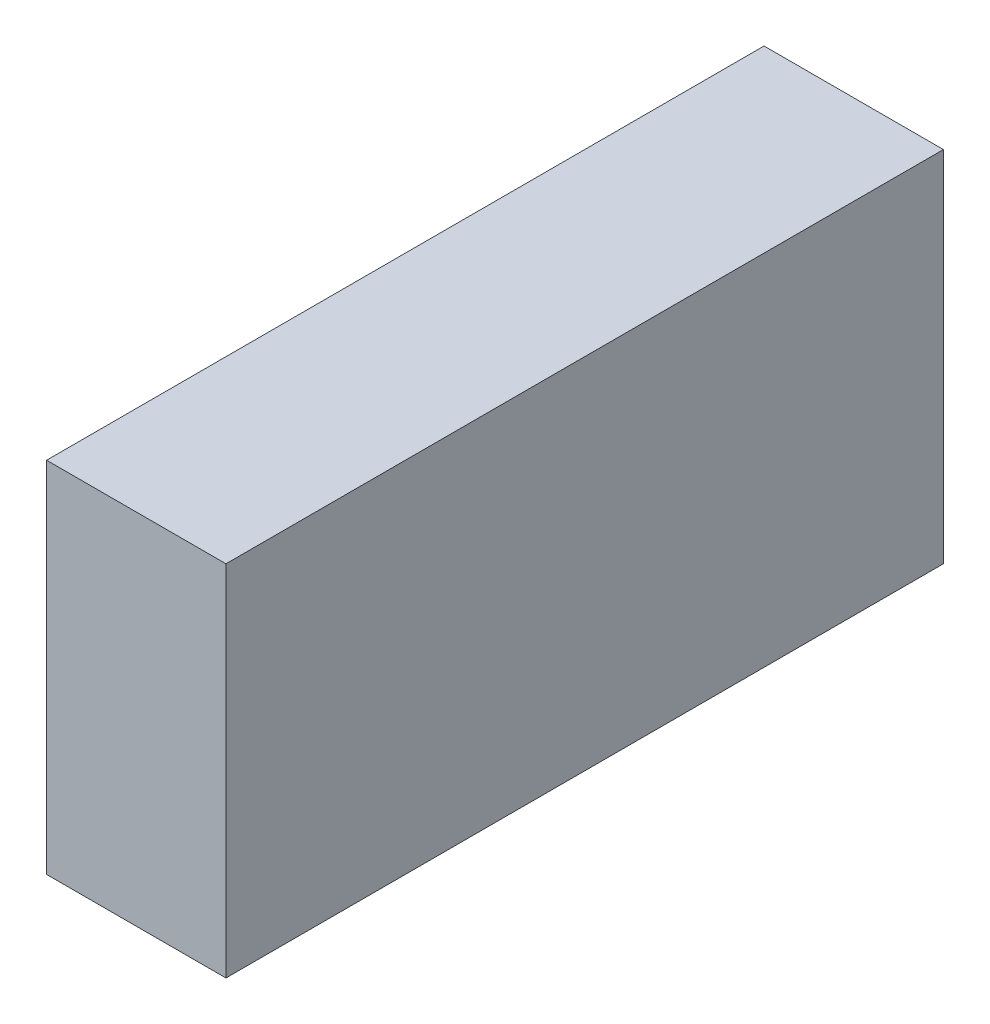
ISO-10303-21;
HEADER;
FILE_DESCRIPTION(('STEP AP214'),'2;1');
FILE_NAME('part.step','',(''),(''),'','','');
FILE_SCHEMA(('AUTOMOTIVE_DESIGN { 1 0 10303 214 1 1 1 1 }'));
ENDSEC;
DATA;
#1=APPLICATION_CONTEXT('core data for automotive mechanical design processes');
#2=APPLICATION_PROTOCOL_DEFINITION('international standard','automotive_design',2000,#1);
#3=PRODUCT_CONTEXT('',#1,'mechanical');
#4=PRODUCT('Part','Part','',(#3));
#5=PRODUCT_RELATED_PRODUCT_CATEGORY('part','',(#4));
#6=PRODUCT_DEFINITION_FORMATION('','',#4);
#7=PRODUCT_DEFINITION_CONTEXT('part definition',#1,'design');
#8=PRODUCT_DEFINITION('design','',#6,#7);
#9=PRODUCT_DEFINITION_SHAPE('','',#8);
#10=(LENGTH_UNIT() NAMED_UNIT(*) SI_UNIT(.MILLI.,.METRE.));
#11=(NAMED_UNIT(*) PLANE_ANGLE_UNIT() SI_UNIT($,.RADIAN.));
#12=(NAMED_UNIT(*) SI_UNIT($,.STERADIAN.) SOLID_ANGLE_UNIT());
#13=UNCERTAINTY_MEASURE_WITH_UNIT(LENGTH_MEASURE(1.E-05),#10,'distance_accuracy_value','');
#14=(GEOMETRIC_REPRESENTATION_CONTEXT(3) GLOBAL_UNCERTAINTY_ASSIGNED_CONTEXT((#13)) GLOBAL_UNIT_ASSIGNED_CONTEXT((#10,
#11,#12)) REPRESENTATION_CONTEXT('',''));
#15=CARTESIAN_POINT('',(0.,0.,0.));
#16=DIRECTION('',(0.,0.,1.));
#17=DIRECTION('',(1.,0.,0.));
#18=AXIS2_PLACEMENT_3D('',#15,#16,#17);
#19=CARTESIAN_POINT('',(10.,0.,0.));
#20=DIRECTION('',(0.,0.,-1.));
#21=DIRECTION('',(-1.,0.,0.));
#22=AXIS2_PLACEMENT_3D('',#19,#20,#21);
#23=PLANE('',#22);
#24=DIRECTION('',(0.,-1.,0.));
#25=VECTOR('',#24,1.);
#26=CARTESIAN_POINT('',(0.,0.,0.));
#27=LINE('',#26,#25);
#28=CARTESIAN_POINT('',(0.,20.,0.));
#29=VERTEX_POINT('',#28);
#30=CARTESIAN_POINT('',(0.,0.,0.));
#31=VERTEX_POINT('',#30);
#32=EDGE_CURVE('E105',#29,#31,#27,.T.);
#33=ORIENTED_EDGE('',*,*,#32,.T.);
#34=DIRECTION('',(-1.,0.,0.));
#35=VECTOR('',#34,1.);
#36=CARTESIAN_POINT('',(10.,0.,0.));
#37=LINE('',#36,#35);
#38=CARTESIAN_POINT('',(10.,0.,0.));
#39=VERTEX_POINT('',#38);
#40=EDGE_CURVE('E11',#39,#31,#37,.T.);
#41=ORIENTED_EDGE('',*,*,#40,.F.);
#42=DIRECTION('',(0.,-1.,0.));
#43=VECTOR('',#42,1.);
#44=CARTESIAN_POINT('',(10.,0.,0.));
#45=LINE('',#44,#43);
#46=CARTESIAN_POINT('',(10.,20.,0.));
#47=VERTEX_POINT('',#46);
#48=EDGE_CURVE('E89',#47,#39,#45,.T.);
#49=ORIENTED_EDGE('',*,*,#48,.F.);
#50=DIRECTION('',(-1.,0.,0.));
#51=VECTOR('',#50,1.);
#52=CARTESIAN_POINT('',(10.,20.,0.));
#53=LINE('',#52,#51);
#54=EDGE_CURVE('E97',#47,#29,#53,.T.);
#55=ORIENTED_EDGE('',*,*,#54,.T.);
#56=EDGE_LOOP('',(#33,#41,#49,#55));
#57=FACE_BOUND('',#56,.T.);
#58=ADVANCED_FACE('F39',(#57),#23,.F.);
#59=CARTESIAN_POINT('',(10.,0.,0.));
#60=DIRECTION('',(0.,1.,0.));
#61=DIRECTION('',(0.,0.,1.));
#62=AXIS2_PLACEMENT_3D('',#59,#60,#61);
#63=PLANE('',#62);
#64=DIRECTION('',(0.,0.,-1.));
#65=VECTOR('',#64,1.);
#66=CARTESIAN_POINT('',(0.,0.,0.));
#67=LINE('',#66,#65);
#68=CARTESIAN_POINT('',(0.,0.,-40.));
#69=VERTEX_POINT('',#68);
#70=EDGE_CURVE('E92',#31,#69,#67,.T.);
#71=ORIENTED_EDGE('',*,*,#70,.T.);
#72=DIRECTION('',(-1.,0.,0.));
#73=VECTOR('',#72,1.);
#74=CARTESIAN_POINT('',(10.,0.,-40.));
#75=LINE('',#74,#73);
#76=CARTESIAN_POINT('',(10.,0.,-40.));
#77=VERTEX_POINT('',#76);
#78=EDGE_CURVE('E50',#77,#69,#75,.T.);
#79=ORIENTED_EDGE('',*,*,#78,.F.);
#80=DIRECTION('',(0.,0.,-1.));
#81=VECTOR('',#80,1.);
#82=CARTESIAN_POINT('',(10.,0.,0.));
#83=LINE('',#82,#81);
#84=EDGE_CURVE('E82',#39,#77,#83,.T.);
#85=ORIENTED_EDGE('',*,*,#84,.F.);
#86=ORIENTED_EDGE('',*,*,#40,.T.);
#87=EDGE_LOOP('',(#71,#79,#85,#86));
#88=FACE_BOUND('',#87,.T.);
#89=ADVANCED_FACE('F93',(#88),#63,.F.);
#90=CARTESIAN_POINT('',(10.,0.,-40.));
#91=DIRECTION('',(0.,0.,1.));
#92=DIRECTION('',(1.,0.,0.));
#93=AXIS2_PLACEMENT_3D('',#90,#91,#92);
#94=PLANE('',#93);
#95=DIRECTION('',(0.,1.,0.));
#96=VECTOR('',#95,1.);
#97=CARTESIAN_POINT('',(0.,0.,-40.));
#98=LINE('',#97,#96);
#99=CARTESIAN_POINT('',(0.,20.,-40.));
#100=VERTEX_POINT('',#99);
#101=EDGE_CURVE('E72',#69,#100,#98,.T.);
#102=ORIENTED_EDGE('',*,*,#101,.T.);
#103=DIRECTION('',(-1.,0.,0.));
#104=VECTOR('',#103,1.);
#105=CARTESIAN_POINT('',(10.,20.,-40.));
#106=LINE('',#105,#104);
#107=CARTESIAN_POINT('',(10.,20.,-40.));
#108=VERTEX_POINT('',#107);
#109=EDGE_CURVE('E94',#108,#100,#106,.T.);
#110=ORIENTED_EDGE('',*,*,#109,.F.);
#111=DIRECTION('',(0.,1.,0.));
#112=VECTOR('',#111,1.);
#113=CARTESIAN_POINT('',(10.,0.,-40.));
#114=LINE('',#113,#112);
#115=EDGE_CURVE('E88',#77,#108,#114,.T.);
#116=ORIENTED_EDGE('',*,*,#115,.F.);
#117=ORIENTED_EDGE('',*,*,#78,.T.);
#118=EDGE_LOOP('',(#102,#110,#116,#117));
#119=FACE_BOUND('',#118,.T.);
#120=ADVANCED_FACE('F96',(#119),#94,.F.);
#121=CARTESIAN_POINT('',(10.,20.,0.));
#122=DIRECTION('',(0.,-1.,0.));
#123=DIRECTION('',(0.,0.,-1.));
#124=AXIS2_PLACEMENT_3D('',#121,#122,#123);
#125=PLANE('',#124);
#126=DIRECTION('',(0.,0.,1.));
#127=VECTOR('',#126,1.);
#128=CARTESIAN_POINT('',(0.,20.,0.));
#129=LINE('',#128,#127);
#130=EDGE_CURVE('E76',#100,#29,#129,.T.);
#131=ORIENTED_EDGE('',*,*,#130,.T.);
#132=ORIENTED_EDGE('',*,*,#54,.F.);
#133=DIRECTION('',(0.,0.,1.));
#134=VECTOR('',#133,1.);
#135=CARTESIAN_POINT('',(10.,20.,0.));
#136=LINE('',#135,#134);
#137=EDGE_CURVE('E54',#108,#47,#136,.T.);
#138=ORIENTED_EDGE('',*,*,#137,.F.);
#139=ORIENTED_EDGE('',*,*,#109,.T.);
#140=EDGE_LOOP('',(#131,#132,#138,#139));
#141=FACE_BOUND('',#140,.T.);
#142=ADVANCED_FACE('F108',(#141),#125,.F.);
#143=CARTESIAN_POINT('',(10.,0.,0.));
#144=DIRECTION('',(-1.,0.,0.));
#145=DIRECTION('',(0.,0.,1.));
#146=AXIS2_PLACEMENT_3D('',#143,#144,#145);
#147=PLANE('',#146);
#148=ORIENTED_EDGE('',*,*,#48,.T.);
#149=ORIENTED_EDGE('',*,*,#84,.T.);
#150=ORIENTED_EDGE('',*,*,#115,.T.);
#151=ORIENTED_EDGE('',*,*,#137,.T.);
#152=EDGE_LOOP('',(#148,#149,#150,#151));
#153=FACE_BOUND('',#152,.T.);
#154=ADVANCED_FACE('F86',(#153),#147,.F.);
#155=CARTESIAN_POINT('',(0.,0.,0.));
#156=DIRECTION('',(-1.,0.,0.));
#157=DIRECTION('',(0.,0.,1.));
#158=AXIS2_PLACEMENT_3D('',#155,#156,#157);
#159=PLANE('',#158);
#160=ORIENTED_EDGE('',*,*,#32,.F.);
#161=ORIENTED_EDGE('',*,*,#130,.F.);
#162=ORIENTED_EDGE('',*,*,#101,.F.);
#163=ORIENTED_EDGE('',*,*,#70,.F.);
#164=EDGE_LOOP('',(#160,#161,#162,#163));
#165=FACE_BOUND('',#164,.T.);
#166=ADVANCED_FACE('F115',(#165),#159,.T.);
#167=CLOSED_SHELL('',(#58,#89,#120,#142,#154,#166));
#168=MANIFOLD_SOLID_BREP('B2',#167);
#169=ADVANCED_BREP_SHAPE_REPRESENTATION('',(#18,#168),#14);
#170=SHAPE_DEFINITION_REPRESENTATION(#9,#169);
ENDSEC;
END-ISO-10303-21;
